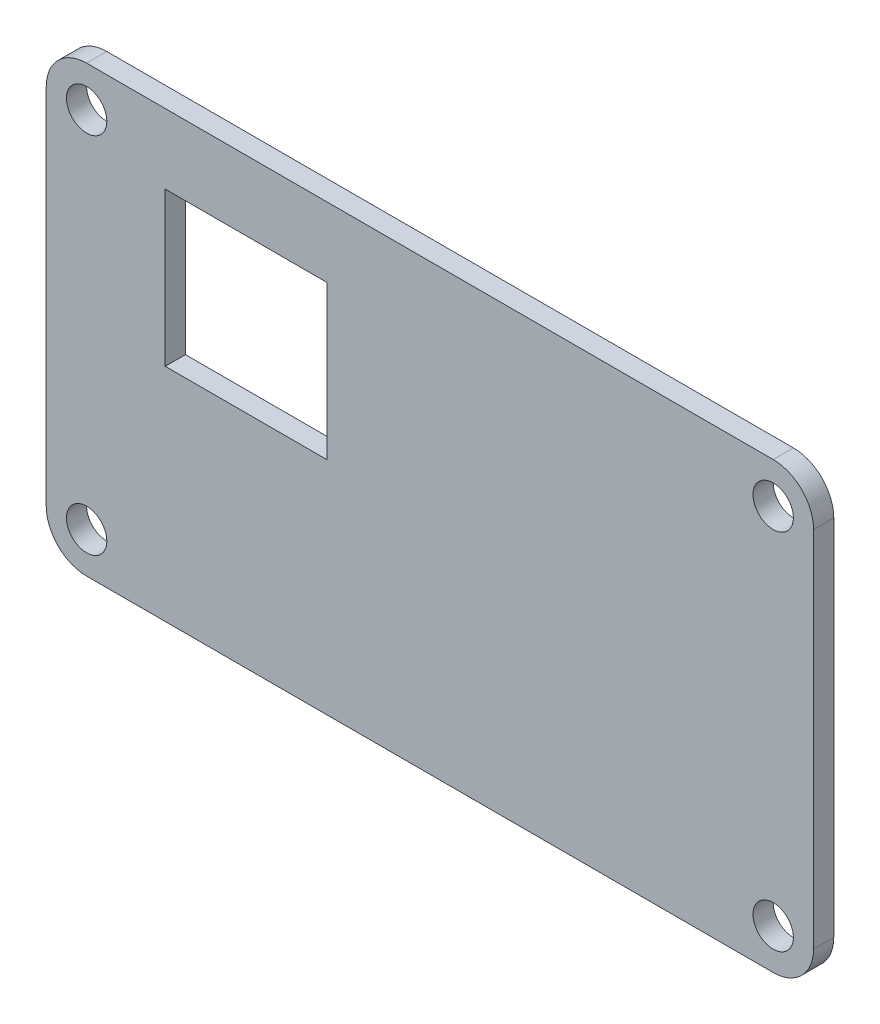
ISO-10303-21;
HEADER;
FILE_DESCRIPTION(('STEP AP214'),'2;1');
FILE_NAME('part.step','',(''),(''),'','','');
FILE_SCHEMA(('AUTOMOTIVE_DESIGN { 1 0 10303 214 1 1 1 1 }'));
ENDSEC;
DATA;
#1=APPLICATION_CONTEXT('core data for automotive mechanical design processes');
#2=APPLICATION_PROTOCOL_DEFINITION('international standard','automotive_design',2000,#1);
#3=PRODUCT_CONTEXT('',#1,'mechanical');
#4=PRODUCT('Part','Part','',(#3));
#5=PRODUCT_RELATED_PRODUCT_CATEGORY('part','',(#4));
#6=PRODUCT_DEFINITION_FORMATION('','',#4);
#7=PRODUCT_DEFINITION_CONTEXT('part definition',#1,'design');
#8=PRODUCT_DEFINITION('design','',#6,#7);
#9=PRODUCT_DEFINITION_SHAPE('','',#8);
#10=(LENGTH_UNIT() NAMED_UNIT(*) SI_UNIT(.MILLI.,.METRE.));
#11=(NAMED_UNIT(*) PLANE_ANGLE_UNIT() SI_UNIT($,.RADIAN.));
#12=(NAMED_UNIT(*) SI_UNIT($,.STERADIAN.) SOLID_ANGLE_UNIT());
#13=UNCERTAINTY_MEASURE_WITH_UNIT(LENGTH_MEASURE(1.E-05),#10,'distance_accuracy_value','');
#14=(GEOMETRIC_REPRESENTATION_CONTEXT(3) GLOBAL_UNCERTAINTY_ASSIGNED_CONTEXT((#13)) GLOBAL_UNIT_ASSIGNED_CONTEXT((#10,
#11,#12)) REPRESENTATION_CONTEXT('',''));
#15=CARTESIAN_POINT('',(0.,0.,0.));
#16=DIRECTION('',(0.,0.,1.));
#17=DIRECTION('',(1.,0.,0.));
#18=AXIS2_PLACEMENT_3D('',#15,#16,#17);
#19=CARTESIAN_POINT('',(180.,100.,5.));
#20=DIRECTION('',(0.,0.,-1.));
#21=DIRECTION('',(-1.,0.,0.));
#22=AXIS2_PLACEMENT_3D('',#19,#20,#21);
#23=CYLINDRICAL_SURFACE('',#22,10.);
#24=CARTESIAN_POINT('',(180.,100.,0.));
#25=DIRECTION('',(0.,0.,1.));
#26=DIRECTION('',(1.,0.,0.));
#27=AXIS2_PLACEMENT_3D('',#24,#25,#26);
#28=CIRCLE('',#27,10.);
#29=CARTESIAN_POINT('',(190.,99.9999999999999,0.));
#30=VERTEX_POINT('',#29);
#31=CARTESIAN_POINT('',(180.,110.,0.));
#32=VERTEX_POINT('',#31);
#33=EDGE_CURVE('E177',#30,#32,#28,.T.);
#34=ORIENTED_EDGE('',*,*,#33,.T.);
#35=DIRECTION('',(0.,0.,-1.));
#36=VECTOR('',#35,1.);
#37=CARTESIAN_POINT('',(180.,110.,5.));
#38=LINE('',#37,#36);
#39=CARTESIAN_POINT('',(180.,110.,5.));
#40=VERTEX_POINT('',#39);
#41=EDGE_CURVE('E232',#40,#32,#38,.T.);
#42=ORIENTED_EDGE('',*,*,#41,.F.);
#43=CARTESIAN_POINT('',(180.,100.,5.));
#44=DIRECTION('',(0.,0.,1.));
#45=DIRECTION('',(1.,0.,0.));
#46=AXIS2_PLACEMENT_3D('',#43,#44,#45);
#47=CIRCLE('',#46,10.);
#48=CARTESIAN_POINT('',(190.,99.9999999999999,5.));
#49=VERTEX_POINT('',#48);
#50=EDGE_CURVE('E178',#49,#40,#47,.T.);
#51=ORIENTED_EDGE('',*,*,#50,.F.);
#52=DIRECTION('',(0.,0.,-1.));
#53=VECTOR('',#52,1.);
#54=CARTESIAN_POINT('',(190.,99.9999999999999,5.));
#55=LINE('',#54,#53);
#56=EDGE_CURVE('E196',#49,#30,#55,.T.);
#57=ORIENTED_EDGE('',*,*,#56,.T.);
#58=EDGE_LOOP('',(#34,#42,#51,#57));
#59=FACE_BOUND('',#58,.T.);
#60=ADVANCED_FACE('F37',(#59),#23,.T.);
#61=CARTESIAN_POINT('',(10.0000000000001,110.,5.));
#62=DIRECTION('',(0.,-1.,0.));
#63=DIRECTION('',(0.,0.,-1.));
#64=AXIS2_PLACEMENT_3D('',#61,#62,#63);
#65=PLANE('',#64);
#66=DIRECTION('',(-1.,0.,0.));
#67=VECTOR('',#66,1.);
#68=CARTESIAN_POINT('',(10.0000000000001,110.,0.));
#69=LINE('',#68,#67);
#70=CARTESIAN_POINT('',(10.0000000000001,110.,0.));
#71=VERTEX_POINT('',#70);
#72=EDGE_CURVE('E199',#32,#71,#69,.T.);
#73=ORIENTED_EDGE('',*,*,#72,.T.);
#74=DIRECTION('',(0.,0.,-1.));
#75=VECTOR('',#74,1.);
#76=CARTESIAN_POINT('',(10.0000000000001,110.,5.));
#77=LINE('',#76,#75);
#78=CARTESIAN_POINT('',(10.0000000000001,110.,5.));
#79=VERTEX_POINT('',#78);
#80=EDGE_CURVE('E229',#79,#71,#77,.T.);
#81=ORIENTED_EDGE('',*,*,#80,.F.);
#82=DIRECTION('',(-1.,0.,0.));
#83=VECTOR('',#82,1.);
#84=CARTESIAN_POINT('',(10.0000000000001,110.,5.));
#85=LINE('',#84,#83);
#86=EDGE_CURVE('E181',#40,#79,#85,.T.);
#87=ORIENTED_EDGE('',*,*,#86,.F.);
#88=ORIENTED_EDGE('',*,*,#41,.T.);
#89=EDGE_LOOP('',(#73,#81,#87,#88));
#90=FACE_BOUND('',#89,.T.);
#91=ADVANCED_FACE('F259',(#90),#65,.F.);
#92=CARTESIAN_POINT('',(10.,100.,5.));
#93=DIRECTION('',(0.,0.,-1.));
#94=DIRECTION('',(-1.,0.,0.));
#95=AXIS2_PLACEMENT_3D('',#92,#93,#94);
#96=CYLINDRICAL_SURFACE('',#95,10.);
#97=CARTESIAN_POINT('',(10.,100.,0.));
#98=DIRECTION('',(0.,0.,1.));
#99=DIRECTION('',(1.,0.,0.));
#100=AXIS2_PLACEMENT_3D('',#97,#98,#99);
#101=CIRCLE('',#100,10.);
#102=CARTESIAN_POINT('',(0.,99.9999999999999,0.));
#103=VERTEX_POINT('',#102);
#104=EDGE_CURVE('E201',#71,#103,#101,.T.);
#105=ORIENTED_EDGE('',*,*,#104,.T.);
#106=DIRECTION('',(0.,0.,-1.));
#107=VECTOR('',#106,1.);
#108=CARTESIAN_POINT('',(0.,99.9999999999999,5.));
#109=LINE('',#108,#107);
#110=CARTESIAN_POINT('',(0.,99.9999999999999,5.));
#111=VERTEX_POINT('',#110);
#112=EDGE_CURVE('E226',#111,#103,#109,.T.);
#113=ORIENTED_EDGE('',*,*,#112,.F.);
#114=CARTESIAN_POINT('',(10.,100.,5.));
#115=DIRECTION('',(0.,0.,1.));
#116=DIRECTION('',(1.,0.,0.));
#117=AXIS2_PLACEMENT_3D('',#114,#115,#116);
#118=CIRCLE('',#117,10.);
#119=EDGE_CURVE('E184',#79,#111,#118,.T.);
#120=ORIENTED_EDGE('',*,*,#119,.F.);
#121=ORIENTED_EDGE('',*,*,#80,.T.);
#122=EDGE_LOOP('',(#105,#113,#120,#121));
#123=FACE_BOUND('',#122,.T.);
#124=ADVANCED_FACE('F264',(#123),#96,.T.);
#125=CARTESIAN_POINT('',(0.,10.0000000000001,5.));
#126=DIRECTION('',(1.,0.,0.));
#127=DIRECTION('',(0.,0.,-1.));
#128=AXIS2_PLACEMENT_3D('',#125,#126,#127);
#129=PLANE('',#128);
#130=DIRECTION('',(0.,-1.,0.));
#131=VECTOR('',#130,1.);
#132=CARTESIAN_POINT('',(0.,10.0000000000001,0.));
#133=LINE('',#132,#131);
#134=CARTESIAN_POINT('',(0.,10.,0.));
#135=VERTEX_POINT('',#134);
#136=EDGE_CURVE('E203',#103,#135,#133,.T.);
#137=ORIENTED_EDGE('',*,*,#136,.T.);
#138=DIRECTION('',(0.,0.,-1.));
#139=VECTOR('',#138,1.);
#140=CARTESIAN_POINT('',(0.,10.,5.));
#141=LINE('',#140,#139);
#142=CARTESIAN_POINT('',(0.,10.,5.));
#143=VERTEX_POINT('',#142);
#144=EDGE_CURVE('E223',#143,#135,#141,.T.);
#145=ORIENTED_EDGE('',*,*,#144,.F.);
#146=DIRECTION('',(0.,-1.,0.));
#147=VECTOR('',#146,1.);
#148=CARTESIAN_POINT('',(0.,10.0000000000001,5.));
#149=LINE('',#148,#147);
#150=EDGE_CURVE('E186',#111,#143,#149,.T.);
#151=ORIENTED_EDGE('',*,*,#150,.F.);
#152=ORIENTED_EDGE('',*,*,#112,.T.);
#153=EDGE_LOOP('',(#137,#145,#151,#152));
#154=FACE_BOUND('',#153,.T.);
#155=ADVANCED_FACE('F298',(#154),#129,.F.);
#156=CARTESIAN_POINT('',(10.,10.,5.));
#157=DIRECTION('',(0.,0.,-1.));
#158=DIRECTION('',(-1.,0.,0.));
#159=AXIS2_PLACEMENT_3D('',#156,#157,#158);
#160=CYLINDRICAL_SURFACE('',#159,10.);
#161=CARTESIAN_POINT('',(10.,10.,0.));
#162=DIRECTION('',(0.,0.,1.));
#163=DIRECTION('',(-1.,0.,0.));
#164=AXIS2_PLACEMENT_3D('',#161,#162,#163);
#165=CIRCLE('',#164,10.);
#166=CARTESIAN_POINT('',(10.0000000000001,0.,0.));
#167=VERTEX_POINT('',#166);
#168=EDGE_CURVE('E205',#135,#167,#165,.T.);
#169=ORIENTED_EDGE('',*,*,#168,.T.);
#170=DIRECTION('',(0.,0.,-1.));
#171=VECTOR('',#170,1.);
#172=CARTESIAN_POINT('',(10.0000000000001,0.,5.));
#173=LINE('',#172,#171);
#174=CARTESIAN_POINT('',(10.0000000000001,0.,5.));
#175=VERTEX_POINT('',#174);
#176=EDGE_CURVE('E220',#175,#167,#173,.T.);
#177=ORIENTED_EDGE('',*,*,#176,.F.);
#178=CARTESIAN_POINT('',(10.,10.,5.));
#179=DIRECTION('',(0.,0.,1.));
#180=DIRECTION('',(-1.,0.,0.));
#181=AXIS2_PLACEMENT_3D('',#178,#179,#180);
#182=CIRCLE('',#181,10.);
#183=EDGE_CURVE('E188',#143,#175,#182,.T.);
#184=ORIENTED_EDGE('',*,*,#183,.F.);
#185=ORIENTED_EDGE('',*,*,#144,.T.);
#186=EDGE_LOOP('',(#169,#177,#184,#185));
#187=FACE_BOUND('',#186,.T.);
#188=ADVANCED_FACE('F294',(#187),#160,.T.);
#189=CARTESIAN_POINT('',(10.0000000000001,0.,5.));
#190=DIRECTION('',(0.,1.,0.));
#191=DIRECTION('',(0.,0.,1.));
#192=AXIS2_PLACEMENT_3D('',#189,#190,#191);
#193=PLANE('',#192);
#194=DIRECTION('',(1.,0.,0.));
#195=VECTOR('',#194,1.);
#196=CARTESIAN_POINT('',(10.0000000000001,0.,0.));
#197=LINE('',#196,#195);
#198=CARTESIAN_POINT('',(180.,0.,0.));
#199=VERTEX_POINT('',#198);
#200=EDGE_CURVE('E207',#167,#199,#197,.T.);
#201=ORIENTED_EDGE('',*,*,#200,.T.);
#202=DIRECTION('',(0.,0.,-1.));
#203=VECTOR('',#202,1.);
#204=CARTESIAN_POINT('',(180.,0.,5.));
#205=LINE('',#204,#203);
#206=CARTESIAN_POINT('',(180.,0.,5.));
#207=VERTEX_POINT('',#206);
#208=EDGE_CURVE('E217',#207,#199,#205,.T.);
#209=ORIENTED_EDGE('',*,*,#208,.F.);
#210=DIRECTION('',(1.,0.,0.));
#211=VECTOR('',#210,1.);
#212=CARTESIAN_POINT('',(10.0000000000001,0.,5.));
#213=LINE('',#212,#211);
#214=EDGE_CURVE('E190',#175,#207,#213,.T.);
#215=ORIENTED_EDGE('',*,*,#214,.F.);
#216=ORIENTED_EDGE('',*,*,#176,.T.);
#217=EDGE_LOOP('',(#201,#209,#215,#216));
#218=FACE_BOUND('',#217,.T.);
#219=ADVANCED_FACE('F289',(#218),#193,.F.);
#220=CARTESIAN_POINT('',(180.,10.,5.));
#221=DIRECTION('',(0.,0.,-1.));
#222=DIRECTION('',(-1.,0.,0.));
#223=AXIS2_PLACEMENT_3D('',#220,#221,#222);
#224=CYLINDRICAL_SURFACE('',#223,10.);
#225=CARTESIAN_POINT('',(180.,10.,0.));
#226=DIRECTION('',(0.,0.,1.));
#227=DIRECTION('',(-1.,0.,0.));
#228=AXIS2_PLACEMENT_3D('',#225,#226,#227);
#229=CIRCLE('',#228,10.);
#230=CARTESIAN_POINT('',(190.,10.0000000000001,0.));
#231=VERTEX_POINT('',#230);
#232=EDGE_CURVE('E209',#199,#231,#229,.T.);
#233=ORIENTED_EDGE('',*,*,#232,.T.);
#234=DIRECTION('',(0.,0.,-1.));
#235=VECTOR('',#234,1.);
#236=CARTESIAN_POINT('',(190.,10.0000000000001,5.));
#237=LINE('',#236,#235);
#238=CARTESIAN_POINT('',(190.,10.0000000000001,5.));
#239=VERTEX_POINT('',#238);
#240=EDGE_CURVE('E214',#239,#231,#237,.T.);
#241=ORIENTED_EDGE('',*,*,#240,.F.);
#242=CARTESIAN_POINT('',(180.,10.,5.));
#243=DIRECTION('',(0.,0.,1.));
#244=DIRECTION('',(-1.,0.,0.));
#245=AXIS2_PLACEMENT_3D('',#242,#243,#244);
#246=CIRCLE('',#245,10.);
#247=EDGE_CURVE('E192',#207,#239,#246,.T.);
#248=ORIENTED_EDGE('',*,*,#247,.F.);
#249=ORIENTED_EDGE('',*,*,#208,.T.);
#250=EDGE_LOOP('',(#233,#241,#248,#249));
#251=FACE_BOUND('',#250,.T.);
#252=ADVANCED_FACE('F284',(#251),#224,.T.);
#253=CARTESIAN_POINT('',(190.,10.0000000000001,5.));
#254=DIRECTION('',(-1.,0.,0.));
#255=DIRECTION('',(0.,0.,1.));
#256=AXIS2_PLACEMENT_3D('',#253,#254,#255);
#257=PLANE('',#256);
#258=DIRECTION('',(0.,1.,0.));
#259=VECTOR('',#258,1.);
#260=CARTESIAN_POINT('',(190.,10.0000000000001,0.));
#261=LINE('',#260,#259);
#262=EDGE_CURVE('E182',#231,#30,#261,.T.);
#263=ORIENTED_EDGE('',*,*,#262,.T.);
#264=ORIENTED_EDGE('',*,*,#56,.F.);
#265=DIRECTION('',(0.,1.,0.));
#266=VECTOR('',#265,1.);
#267=CARTESIAN_POINT('',(190.,10.0000000000001,5.));
#268=LINE('',#267,#266);
#269=EDGE_CURVE('E194',#239,#49,#268,.T.);
#270=ORIENTED_EDGE('',*,*,#269,.F.);
#271=ORIENTED_EDGE('',*,*,#240,.T.);
#272=EDGE_LOOP('',(#263,#264,#270,#271));
#273=FACE_BOUND('',#272,.T.);
#274=ADVANCED_FACE('F282',(#273),#257,.F.);
#275=CARTESIAN_POINT('',(180.,100.,5.));
#276=DIRECTION('',(0.,0.,1.));
#277=DIRECTION('',(1.,0.,0.));
#278=AXIS2_PLACEMENT_3D('',#275,#276,#277);
#279=PLANE('',#278);
#280=DIRECTION('',(0.,-1.,0.));
#281=VECTOR('',#280,1.);
#282=CARTESIAN_POINT('',(29.4649615264902,54.7269373396938,5.));
#283=LINE('',#282,#281);
#284=CARTESIAN_POINT('',(29.4649615264902,92.7269373396938,5.));
#285=VERTEX_POINT('',#284);
#286=CARTESIAN_POINT('',(29.4649615264902,54.7269373396938,5.));
#287=VERTEX_POINT('',#286);
#288=EDGE_CURVE('E51',#285,#287,#283,.T.);
#289=ORIENTED_EDGE('',*,*,#288,.F.);
#290=DIRECTION('',(-1.,0.,0.));
#291=VECTOR('',#290,1.);
#292=CARTESIAN_POINT('',(29.4649615264902,92.7269373396938,5.));
#293=LINE('',#292,#291);
#294=CARTESIAN_POINT('',(69.4649615264902,92.7269373396938,5.));
#295=VERTEX_POINT('',#294);
#296=EDGE_CURVE('E144',#295,#285,#293,.T.);
#297=ORIENTED_EDGE('',*,*,#296,.F.);
#298=DIRECTION('',(0.,1.,0.));
#299=VECTOR('',#298,1.);
#300=CARTESIAN_POINT('',(69.4649615264902,54.7269373396938,5.));
#301=LINE('',#300,#299);
#302=CARTESIAN_POINT('',(69.4649615264902,54.7269373396938,5.));
#303=VERTEX_POINT('',#302);
#304=EDGE_CURVE('E128',#303,#295,#301,.T.);
#305=ORIENTED_EDGE('',*,*,#304,.F.);
#306=DIRECTION('',(1.,0.,0.));
#307=VECTOR('',#306,1.);
#308=CARTESIAN_POINT('',(29.4649615264902,54.7269373396938,5.));
#309=LINE('',#308,#307);
#310=EDGE_CURVE('E137',#287,#303,#309,.T.);
#311=ORIENTED_EDGE('',*,*,#310,.F.);
#312=EDGE_LOOP('',(#289,#297,#305,#311));
#313=FACE_BOUND('',#312,.T.);
#314=CARTESIAN_POINT('',(10.,100.,5.));
#315=DIRECTION('',(0.,0.,1.));
#316=DIRECTION('',(1.,0.,0.));
#317=AXIS2_PLACEMENT_3D('',#314,#315,#316);
#318=CIRCLE('',#317,5.);
#319=CARTESIAN_POINT('',(15.,100.,5.));
#320=VERTEX_POINT('',#319);
#321=EDGE_CURVE('E174',#320,#320,#318,.T.);
#322=ORIENTED_EDGE('',*,*,#321,.F.);
#323=EDGE_LOOP('',(#322));
#324=FACE_BOUND('',#323,.T.);
#325=CARTESIAN_POINT('',(180.,10.,5.));
#326=DIRECTION('',(0.,0.,1.));
#327=DIRECTION('',(1.,0.,0.));
#328=AXIS2_PLACEMENT_3D('',#325,#326,#327);
#329=CIRCLE('',#328,4.99999999999999);
#330=CARTESIAN_POINT('',(185.,10.,5.));
#331=VERTEX_POINT('',#330);
#332=EDGE_CURVE('E171',#331,#331,#329,.T.);
#333=ORIENTED_EDGE('',*,*,#332,.F.);
#334=EDGE_LOOP('',(#333));
#335=FACE_BOUND('',#334,.T.);
#336=CARTESIAN_POINT('',(10.,10.,5.));
#337=DIRECTION('',(0.,0.,1.));
#338=DIRECTION('',(1.,0.,0.));
#339=AXIS2_PLACEMENT_3D('',#336,#337,#338);
#340=CIRCLE('',#339,5.);
#341=CARTESIAN_POINT('',(15.,10.,5.));
#342=VERTEX_POINT('',#341);
#343=EDGE_CURVE('E168',#342,#342,#340,.T.);
#344=ORIENTED_EDGE('',*,*,#343,.F.);
#345=EDGE_LOOP('',(#344));
#346=FACE_BOUND('',#345,.T.);
#347=CARTESIAN_POINT('',(180.,100.,5.));
#348=DIRECTION('',(0.,0.,1.));
#349=DIRECTION('',(1.,0.,0.));
#350=AXIS2_PLACEMENT_3D('',#347,#348,#349);
#351=CIRCLE('',#350,4.99999999999999);
#352=CARTESIAN_POINT('',(185.,100.,5.));
#353=VERTEX_POINT('',#352);
#354=EDGE_CURVE('E165',#353,#353,#351,.T.);
#355=ORIENTED_EDGE('',*,*,#354,.F.);
#356=EDGE_LOOP('',(#355));
#357=FACE_BOUND('',#356,.T.);
#358=ORIENTED_EDGE('',*,*,#50,.T.);
#359=ORIENTED_EDGE('',*,*,#86,.T.);
#360=ORIENTED_EDGE('',*,*,#119,.T.);
#361=ORIENTED_EDGE('',*,*,#150,.T.);
#362=ORIENTED_EDGE('',*,*,#183,.T.);
#363=ORIENTED_EDGE('',*,*,#214,.T.);
#364=ORIENTED_EDGE('',*,*,#247,.T.);
#365=ORIENTED_EDGE('',*,*,#269,.T.);
#366=EDGE_LOOP('',(#358,#359,#360,#361,#362,#363,#364,#365));
#367=FACE_BOUND('',#366,.T.);
#368=ADVANCED_FACE('F141',(#313,#324,#335,#346,#357,#367),#279,.T.);
#369=CARTESIAN_POINT('',(180.,100.,0.));
#370=DIRECTION('',(0.,0.,1.));
#371=DIRECTION('',(1.,0.,0.));
#372=AXIS2_PLACEMENT_3D('',#369,#370,#371);
#373=PLANE('',#372);
#374=DIRECTION('',(-1.,0.,0.));
#375=VECTOR('',#374,1.);
#376=CARTESIAN_POINT('',(180.,92.7269373396938,0.));
#377=LINE('',#376,#375);
#378=CARTESIAN_POINT('',(69.4649615264902,92.7269373396938,0.));
#379=VERTEX_POINT('',#378);
#380=CARTESIAN_POINT('',(29.4649615264902,92.7269373396938,0.));
#381=VERTEX_POINT('',#380);
#382=EDGE_CURVE('E44',#379,#381,#377,.T.);
#383=ORIENTED_EDGE('',*,*,#382,.T.);
#384=DIRECTION('',(0.,-1.,0.));
#385=VECTOR('',#384,1.);
#386=CARTESIAN_POINT('',(29.4649615264902,100.,0.));
#387=LINE('',#386,#385);
#388=CARTESIAN_POINT('',(29.4649615264902,54.7269373396938,0.));
#389=VERTEX_POINT('',#388);
#390=EDGE_CURVE('E11',#381,#389,#387,.T.);
#391=ORIENTED_EDGE('',*,*,#390,.T.);
#392=DIRECTION('',(1.,0.,0.));
#393=VECTOR('',#392,1.);
#394=CARTESIAN_POINT('',(180.,54.7269373396938,0.));
#395=LINE('',#394,#393);
#396=CARTESIAN_POINT('',(69.4649615264902,54.7269373396938,0.));
#397=VERTEX_POINT('',#396);
#398=EDGE_CURVE('E235',#389,#397,#395,.T.);
#399=ORIENTED_EDGE('',*,*,#398,.T.);
#400=DIRECTION('',(0.,1.,0.));
#401=VECTOR('',#400,1.);
#402=CARTESIAN_POINT('',(69.4649615264902,100.,0.));
#403=LINE('',#402,#401);
#404=EDGE_CURVE('E131',#397,#379,#403,.T.);
#405=ORIENTED_EDGE('',*,*,#404,.T.);
#406=EDGE_LOOP('',(#383,#391,#399,#405));
#407=FACE_BOUND('',#406,.T.);
#408=CARTESIAN_POINT('',(10.,100.,0.));
#409=DIRECTION('',(0.,0.,-1.));
#410=DIRECTION('',(-1.,0.,0.));
#411=AXIS2_PLACEMENT_3D('',#408,#409,#410);
#412=CIRCLE('',#411,5.);
#413=CARTESIAN_POINT('',(5.,100.,0.));
#414=VERTEX_POINT('',#413);
#415=EDGE_CURVE('E157',#414,#414,#412,.T.);
#416=ORIENTED_EDGE('',*,*,#415,.F.);
#417=EDGE_LOOP('',(#416));
#418=FACE_BOUND('',#417,.T.);
#419=CARTESIAN_POINT('',(180.,10.,0.));
#420=DIRECTION('',(0.,0.,-1.));
#421=DIRECTION('',(-1.,0.,0.));
#422=AXIS2_PLACEMENT_3D('',#419,#420,#421);
#423=CIRCLE('',#422,4.99999999999999);
#424=CARTESIAN_POINT('',(175.,10.,0.));
#425=VERTEX_POINT('',#424);
#426=EDGE_CURVE('E156',#425,#425,#423,.T.);
#427=ORIENTED_EDGE('',*,*,#426,.F.);
#428=EDGE_LOOP('',(#427));
#429=FACE_BOUND('',#428,.T.);
#430=CARTESIAN_POINT('',(10.,10.,0.));
#431=DIRECTION('',(0.,0.,-1.));
#432=DIRECTION('',(-1.,0.,0.));
#433=AXIS2_PLACEMENT_3D('',#430,#431,#432);
#434=CIRCLE('',#433,5.);
#435=CARTESIAN_POINT('',(5.,10.,0.));
#436=VERTEX_POINT('',#435);
#437=EDGE_CURVE('E151',#436,#436,#434,.T.);
#438=ORIENTED_EDGE('',*,*,#437,.F.);
#439=EDGE_LOOP('',(#438));
#440=FACE_BOUND('',#439,.T.);
#441=CARTESIAN_POINT('',(180.,100.,0.));
#442=DIRECTION('',(0.,0.,-1.));
#443=DIRECTION('',(-1.,0.,0.));
#444=AXIS2_PLACEMENT_3D('',#441,#442,#443);
#445=CIRCLE('',#444,4.99999999999999);
#446=CARTESIAN_POINT('',(175.,100.,0.));
#447=VERTEX_POINT('',#446);
#448=EDGE_CURVE('E160',#447,#447,#445,.T.);
#449=ORIENTED_EDGE('',*,*,#448,.F.);
#450=EDGE_LOOP('',(#449));
#451=FACE_BOUND('',#450,.T.);
#452=ORIENTED_EDGE('',*,*,#33,.F.);
#453=ORIENTED_EDGE('',*,*,#262,.F.);
#454=ORIENTED_EDGE('',*,*,#232,.F.);
#455=ORIENTED_EDGE('',*,*,#200,.F.);
#456=ORIENTED_EDGE('',*,*,#168,.F.);
#457=ORIENTED_EDGE('',*,*,#136,.F.);
#458=ORIENTED_EDGE('',*,*,#104,.F.);
#459=ORIENTED_EDGE('',*,*,#72,.F.);
#460=EDGE_LOOP('',(#452,#453,#454,#455,#456,#457,#458,#459));
#461=FACE_BOUND('',#460,.T.);
#462=ADVANCED_FACE('F239',(#407,#418,#429,#440,#451,#461),#373,.F.);
#463=CARTESIAN_POINT('',(180.,100.,35.));
#464=DIRECTION('',(0.,0.,-1.));
#465=DIRECTION('',(-1.,0.,0.));
#466=AXIS2_PLACEMENT_3D('',#463,#464,#465);
#467=CYLINDRICAL_SURFACE('',#466,4.99999999999999);
#468=ORIENTED_EDGE('',*,*,#354,.T.);
#469=EDGE_LOOP('',(#468));
#470=FACE_BOUND('',#469,.T.);
#471=ORIENTED_EDGE('',*,*,#448,.T.);
#472=EDGE_LOOP('',(#471));
#473=FACE_BOUND('',#472,.T.);
#474=ADVANCED_FACE('F318',(#470,#473),#467,.F.);
#475=CARTESIAN_POINT('',(10.,10.,35.));
#476=DIRECTION('',(0.,0.,-1.));
#477=DIRECTION('',(-1.,0.,0.));
#478=AXIS2_PLACEMENT_3D('',#475,#476,#477);
#479=CYLINDRICAL_SURFACE('',#478,5.);
#480=ORIENTED_EDGE('',*,*,#343,.T.);
#481=EDGE_LOOP('',(#480));
#482=FACE_BOUND('',#481,.T.);
#483=ORIENTED_EDGE('',*,*,#437,.T.);
#484=EDGE_LOOP('',(#483));
#485=FACE_BOUND('',#484,.T.);
#486=ADVANCED_FACE('F323',(#482,#485),#479,.F.);
#487=CARTESIAN_POINT('',(180.,10.,35.));
#488=DIRECTION('',(0.,0.,-1.));
#489=DIRECTION('',(-1.,0.,0.));
#490=AXIS2_PLACEMENT_3D('',#487,#488,#489);
#491=CYLINDRICAL_SURFACE('',#490,4.99999999999999);
#492=ORIENTED_EDGE('',*,*,#332,.T.);
#493=EDGE_LOOP('',(#492));
#494=FACE_BOUND('',#493,.T.);
#495=ORIENTED_EDGE('',*,*,#426,.T.);
#496=EDGE_LOOP('',(#495));
#497=FACE_BOUND('',#496,.T.);
#498=ADVANCED_FACE('F253',(#494,#497),#491,.F.);
#499=CARTESIAN_POINT('',(10.,100.,35.));
#500=DIRECTION('',(0.,0.,-1.));
#501=DIRECTION('',(-1.,0.,0.));
#502=AXIS2_PLACEMENT_3D('',#499,#500,#501);
#503=CYLINDRICAL_SURFACE('',#502,5.);
#504=ORIENTED_EDGE('',*,*,#321,.T.);
#505=EDGE_LOOP('',(#504));
#506=FACE_BOUND('',#505,.T.);
#507=ORIENTED_EDGE('',*,*,#415,.T.);
#508=EDGE_LOOP('',(#507));
#509=FACE_BOUND('',#508,.T.);
#510=ADVANCED_FACE('F246',(#506,#509),#503,.F.);
#511=CARTESIAN_POINT('',(29.4649615264902,54.7269373396938,-30.));
#512=DIRECTION('',(-1.,0.,0.));
#513=DIRECTION('',(0.,0.,1.));
#514=AXIS2_PLACEMENT_3D('',#511,#512,#513);
#515=PLANE('',#514);
#516=DIRECTION('',(0.,0.,1.));
#517=VECTOR('',#516,1.);
#518=CARTESIAN_POINT('',(29.4649615264902,92.7269373396938,-30.));
#519=LINE('',#518,#517);
#520=EDGE_CURVE('E149',#381,#285,#519,.T.);
#521=ORIENTED_EDGE('',*,*,#520,.T.);
#522=ORIENTED_EDGE('',*,*,#288,.T.);
#523=DIRECTION('',(0.,0.,1.));
#524=VECTOR('',#523,1.);
#525=CARTESIAN_POINT('',(29.4649615264902,54.7269373396938,-30.));
#526=LINE('',#525,#524);
#527=EDGE_CURVE('E134',#389,#287,#526,.T.);
#528=ORIENTED_EDGE('',*,*,#527,.F.);
#529=ORIENTED_EDGE('',*,*,#390,.F.);
#530=EDGE_LOOP('',(#521,#522,#528,#529));
#531=FACE_BOUND('',#530,.T.);
#532=ADVANCED_FACE('F244',(#531),#515,.F.);
#533=CARTESIAN_POINT('',(29.4649615264902,92.7269373396938,-30.));
#534=DIRECTION('',(0.,1.,0.));
#535=DIRECTION('',(0.,0.,1.));
#536=AXIS2_PLACEMENT_3D('',#533,#534,#535);
#537=PLANE('',#536);
#538=DIRECTION('',(0.,0.,1.));
#539=VECTOR('',#538,1.);
#540=CARTESIAN_POINT('',(69.4649615264902,92.7269373396938,-30.));
#541=LINE('',#540,#539);
#542=EDGE_CURVE('E133',#379,#295,#541,.T.);
#543=ORIENTED_EDGE('',*,*,#542,.T.);
#544=ORIENTED_EDGE('',*,*,#296,.T.);
#545=ORIENTED_EDGE('',*,*,#520,.F.);
#546=ORIENTED_EDGE('',*,*,#382,.F.);
#547=EDGE_LOOP('',(#543,#544,#545,#546));
#548=FACE_BOUND('',#547,.T.);
#549=ADVANCED_FACE('F243',(#548),#537,.F.);
#550=CARTESIAN_POINT('',(69.4649615264902,54.7269373396938,-30.));
#551=DIRECTION('',(1.,0.,0.));
#552=DIRECTION('',(0.,0.,-1.));
#553=AXIS2_PLACEMENT_3D('',#550,#551,#552);
#554=PLANE('',#553);
#555=DIRECTION('',(0.,0.,1.));
#556=VECTOR('',#555,1.);
#557=CARTESIAN_POINT('',(69.4649615264902,54.7269373396938,-30.));
#558=LINE('',#557,#556);
#559=EDGE_CURVE('E59',#397,#303,#558,.T.);
#560=ORIENTED_EDGE('',*,*,#559,.T.);
#561=ORIENTED_EDGE('',*,*,#304,.T.);
#562=ORIENTED_EDGE('',*,*,#542,.F.);
#563=ORIENTED_EDGE('',*,*,#404,.F.);
#564=EDGE_LOOP('',(#560,#561,#562,#563));
#565=FACE_BOUND('',#564,.T.);
#566=ADVANCED_FACE('F125',(#565),#554,.F.);
#567=CARTESIAN_POINT('',(29.4649615264902,54.7269373396938,-30.));
#568=DIRECTION('',(0.,-1.,0.));
#569=DIRECTION('',(0.,0.,-1.));
#570=AXIS2_PLACEMENT_3D('',#567,#568,#569);
#571=PLANE('',#570);
#572=ORIENTED_EDGE('',*,*,#527,.T.);
#573=ORIENTED_EDGE('',*,*,#310,.T.);
#574=ORIENTED_EDGE('',*,*,#559,.F.);
#575=ORIENTED_EDGE('',*,*,#398,.F.);
#576=EDGE_LOOP('',(#572,#573,#574,#575));
#577=FACE_BOUND('',#576,.T.);
#578=ADVANCED_FACE('F138',(#577),#571,.F.);
#579=CLOSED_SHELL('',(#60,#91,#124,#155,#188,#219,#252,#274,#368,#462,#474,#486,#498,#510,#532,
#549,#566,#578));
#580=MANIFOLD_SOLID_BREP('B2',#579);
#581=ADVANCED_BREP_SHAPE_REPRESENTATION('',(#18,#580),#14);
#582=SHAPE_DEFINITION_REPRESENTATION(#9,#581);
ENDSEC;
END-ISO-10303-21;
